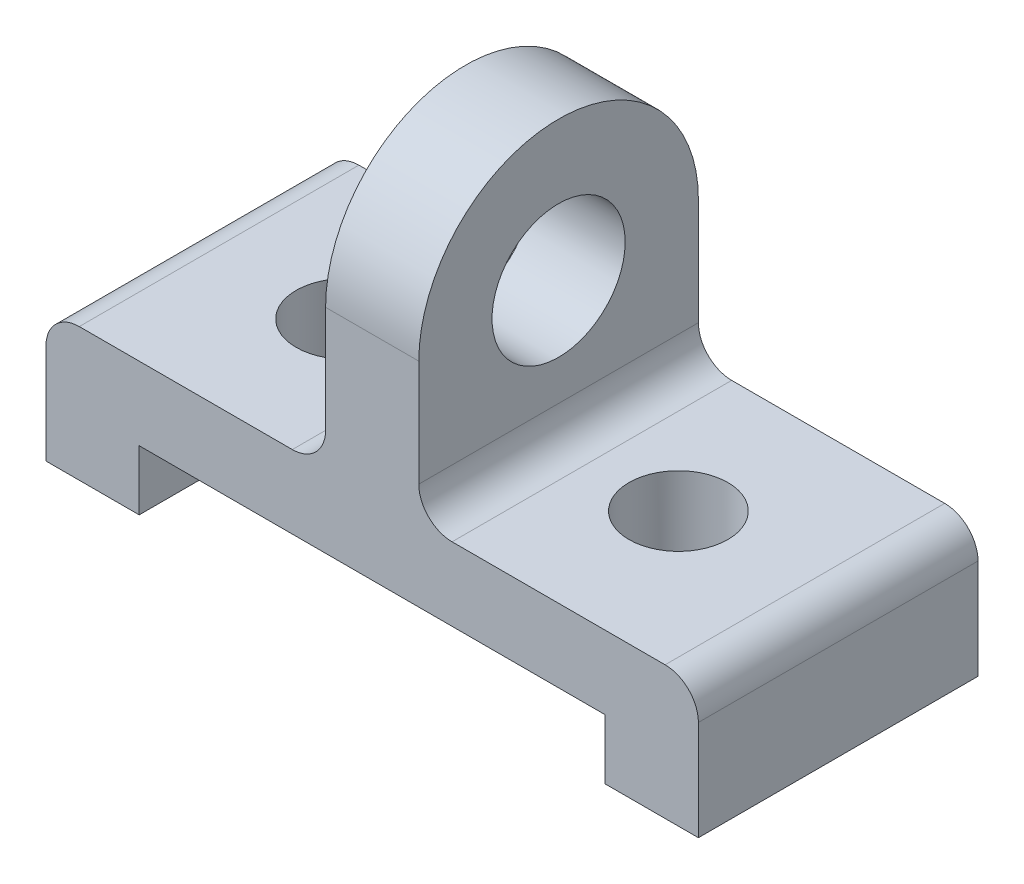
ISO-10303-21;
HEADER;
FILE_DESCRIPTION(('STEP AP214'),'2;1');
FILE_NAME('part.step','',(''),(''),'','','');
FILE_SCHEMA(('AUTOMOTIVE_DESIGN { 1 0 10303 214 1 1 1 1 }'));
ENDSEC;
DATA;
#1=APPLICATION_CONTEXT('core data for automotive mechanical design processes');
#2=APPLICATION_PROTOCOL_DEFINITION('international standard','automotive_design',2000,#1);
#3=PRODUCT_CONTEXT('',#1,'mechanical');
#4=PRODUCT('Part','Part','',(#3));
#5=PRODUCT_RELATED_PRODUCT_CATEGORY('part','',(#4));
#6=PRODUCT_DEFINITION_FORMATION('','',#4);
#7=PRODUCT_DEFINITION_CONTEXT('part definition',#1,'design');
#8=PRODUCT_DEFINITION('design','',#6,#7);
#9=PRODUCT_DEFINITION_SHAPE('','',#8);
#10=(LENGTH_UNIT() NAMED_UNIT(*) SI_UNIT(.MILLI.,.METRE.));
#11=(NAMED_UNIT(*) PLANE_ANGLE_UNIT() SI_UNIT($,.RADIAN.));
#12=(NAMED_UNIT(*) SI_UNIT($,.STERADIAN.) SOLID_ANGLE_UNIT());
#13=UNCERTAINTY_MEASURE_WITH_UNIT(LENGTH_MEASURE(1.E-05),#10,'distance_accuracy_value','');
#14=(GEOMETRIC_REPRESENTATION_CONTEXT(3) GLOBAL_UNCERTAINTY_ASSIGNED_CONTEXT((#13)) GLOBAL_UNIT_ASSIGNED_CONTEXT((#10,
#11,#12)) REPRESENTATION_CONTEXT('',''));
#15=CARTESIAN_POINT('',(0.,0.,0.));
#16=DIRECTION('',(0.,0.,1.));
#17=DIRECTION('',(1.,0.,0.));
#18=AXIS2_PLACEMENT_3D('',#15,#16,#17);
#19=CARTESIAN_POINT('',(7.,41.,0.));
#20=DIRECTION('',(-1.,0.,0.));
#21=DIRECTION('',(0.,0.,1.));
#22=AXIS2_PLACEMENT_3D('',#19,#20,#21);
#23=CYLINDRICAL_SURFACE('',#22,21.);
#24=DIRECTION('',(-1.,0.,0.));
#25=VECTOR('',#24,1.);
#26=CARTESIAN_POINT('',(-49.,41.,21.));
#27=LINE('',#26,#25);
#28=CARTESIAN_POINT('',(7.,41.,21.));
#29=VERTEX_POINT('',#28);
#30=CARTESIAN_POINT('',(-7.,41.,21.));
#31=VERTEX_POINT('',#30);
#32=EDGE_CURVE('E202',#29,#31,#27,.T.);
#33=ORIENTED_EDGE('',*,*,#32,.F.);
#34=CARTESIAN_POINT('',(7.,41.,0.));
#35=DIRECTION('',(-1.,0.,0.));
#36=DIRECTION('',(0.,0.,1.));
#37=AXIS2_PLACEMENT_3D('',#34,#35,#36);
#38=CIRCLE('',#37,21.);
#39=CARTESIAN_POINT('',(7.,41.,-21.));
#40=VERTEX_POINT('',#39);
#41=EDGE_CURVE('E208',#40,#29,#38,.F.);
#42=ORIENTED_EDGE('',*,*,#41,.F.);
#43=DIRECTION('',(-1.,0.,0.));
#44=VECTOR('',#43,1.);
#45=CARTESIAN_POINT('',(-49.,41.,-21.));
#46=LINE('',#45,#44);
#47=CARTESIAN_POINT('',(-7.,41.,-21.));
#48=VERTEX_POINT('',#47);
#49=EDGE_CURVE('E205',#48,#40,#46,.F.);
#50=ORIENTED_EDGE('',*,*,#49,.F.);
#51=CARTESIAN_POINT('',(-7.,41.,0.));
#52=DIRECTION('',(-1.,0.,0.));
#53=DIRECTION('',(0.,0.,1.));
#54=AXIS2_PLACEMENT_3D('',#51,#52,#53);
#55=CIRCLE('',#54,21.);
#56=EDGE_CURVE('E210',#31,#48,#55,.T.);
#57=ORIENTED_EDGE('',*,*,#56,.F.);
#58=EDGE_LOOP('',(#33,#42,#50,#57));
#59=FACE_BOUND('',#58,.T.);
#60=ADVANCED_FACE('F41',(#59),#23,.T.);
#61=CARTESIAN_POINT('',(0.,20.,0.));
#62=DIRECTION('',(0.,-1.,0.));
#63=DIRECTION('',(0.,0.,-1.));
#64=AXIS2_PLACEMENT_3D('',#61,#62,#63);
#65=PLANE('',#64);
#66=CARTESIAN_POINT('',(25.,20.,0.));
#67=DIRECTION('',(0.,1.,0.));
#68=DIRECTION('',(0.,0.,-1.));
#69=AXIS2_PLACEMENT_3D('',#66,#67,#68);
#70=CIRCLE('',#69,7.42425022338263);
#71=CARTESIAN_POINT('',(25.,20.,-7.42425022338264));
#72=VERTEX_POINT('',#71);
#73=EDGE_CURVE('E300',#72,#72,#70,.T.);
#74=ORIENTED_EDGE('',*,*,#73,.F.);
#75=EDGE_LOOP('',(#74));
#76=FACE_BOUND('',#75,.T.);
#77=DIRECTION('',(1.,0.,0.));
#78=VECTOR('',#77,1.);
#79=CARTESIAN_POINT('',(-49.,20.,21.));
#80=LINE('',#79,#78);
#81=CARTESIAN_POINT('',(12.,20.,21.));
#82=VERTEX_POINT('',#81);
#83=CARTESIAN_POINT('',(44.,20.,21.));
#84=VERTEX_POINT('',#83);
#85=EDGE_CURVE('E276',#82,#84,#80,.T.);
#86=ORIENTED_EDGE('',*,*,#85,.T.);
#87=DIRECTION('',(0.,0.,-1.));
#88=VECTOR('',#87,1.);
#89=CARTESIAN_POINT('',(44.,20.,0.));
#90=LINE('',#89,#88);
#91=CARTESIAN_POINT('',(44.,20.,-21.));
#92=VERTEX_POINT('',#91);
#93=EDGE_CURVE('E242',#84,#92,#90,.T.);
#94=ORIENTED_EDGE('',*,*,#93,.T.);
#95=DIRECTION('',(-1.,0.,0.));
#96=VECTOR('',#95,1.);
#97=CARTESIAN_POINT('',(-49.,20.,-21.));
#98=LINE('',#97,#96);
#99=CARTESIAN_POINT('',(12.,20.,-21.));
#100=VERTEX_POINT('',#99);
#101=EDGE_CURVE('E278',#92,#100,#98,.T.);
#102=ORIENTED_EDGE('',*,*,#101,.T.);
#103=DIRECTION('',(0.,0.,-1.));
#104=VECTOR('',#103,1.);
#105=CARTESIAN_POINT('',(12.,20.,21.));
#106=LINE('',#105,#104);
#107=EDGE_CURVE('E240',#100,#82,#106,.F.);
#108=ORIENTED_EDGE('',*,*,#107,.T.);
#109=EDGE_LOOP('',(#86,#94,#102,#108));
#110=FACE_BOUND('',#109,.T.);
#111=ADVANCED_FACE('F312',(#76,#110),#65,.F.);
#112=CARTESIAN_POINT('',(0.,0.,0.));
#113=DIRECTION('',(0.,-1.,0.));
#114=DIRECTION('',(0.,0.,-1.));
#115=AXIS2_PLACEMENT_3D('',#112,#113,#114);
#116=PLANE('',#115);
#117=DIRECTION('',(0.,0.,1.));
#118=VECTOR('',#117,1.);
#119=CARTESIAN_POINT('',(-35.,0.,-21.));
#120=LINE('',#119,#118);
#121=CARTESIAN_POINT('',(-35.,0.,-21.));
#122=VERTEX_POINT('',#121);
#123=CARTESIAN_POINT('',(-35.,0.,21.));
#124=VERTEX_POINT('',#123);
#125=EDGE_CURVE('E152',#122,#124,#120,.T.);
#126=ORIENTED_EDGE('',*,*,#125,.T.);
#127=DIRECTION('',(1.,0.,0.));
#128=VECTOR('',#127,1.);
#129=CARTESIAN_POINT('',(-49.,0.,21.));
#130=LINE('',#129,#128);
#131=CARTESIAN_POINT('',(-49.,0.,21.));
#132=VERTEX_POINT('',#131);
#133=EDGE_CURVE('E190',#132,#124,#130,.T.);
#134=ORIENTED_EDGE('',*,*,#133,.F.);
#135=DIRECTION('',(0.,0.,1.));
#136=VECTOR('',#135,1.);
#137=CARTESIAN_POINT('',(-49.,0.,21.));
#138=LINE('',#137,#136);
#139=CARTESIAN_POINT('',(-49.,0.,-21.));
#140=VERTEX_POINT('',#139);
#141=EDGE_CURVE('E178',#140,#132,#138,.T.);
#142=ORIENTED_EDGE('',*,*,#141,.F.);
#143=DIRECTION('',(-1.,0.,0.));
#144=VECTOR('',#143,1.);
#145=CARTESIAN_POINT('',(-49.,0.,-21.));
#146=LINE('',#145,#144);
#147=EDGE_CURVE('E169',#122,#140,#146,.T.);
#148=ORIENTED_EDGE('',*,*,#147,.F.);
#149=EDGE_LOOP('',(#126,#134,#142,#148));
#150=FACE_BOUND('',#149,.T.);
#151=ADVANCED_FACE('F176',(#150),#116,.T.);
#152=CARTESIAN_POINT('',(49.,20.,21.));
#153=DIRECTION('',(-1.,0.,0.));
#154=DIRECTION('',(0.,0.,1.));
#155=AXIS2_PLACEMENT_3D('',#152,#153,#154);
#156=PLANE('',#155);
#157=DIRECTION('',(0.,-1.,0.));
#158=VECTOR('',#157,1.);
#159=CARTESIAN_POINT('',(49.,20.,-21.));
#160=LINE('',#159,#158);
#161=CARTESIAN_POINT('',(49.,15.,-21.));
#162=VERTEX_POINT('',#161);
#163=CARTESIAN_POINT('',(49.,0.,-21.));
#164=VERTEX_POINT('',#163);
#165=EDGE_CURVE('E200',#162,#164,#160,.T.);
#166=ORIENTED_EDGE('',*,*,#165,.F.);
#167=DIRECTION('',(0.,0.,-1.));
#168=VECTOR('',#167,1.);
#169=CARTESIAN_POINT('',(49.,15.,21.));
#170=LINE('',#169,#168);
#171=CARTESIAN_POINT('',(49.,15.,21.));
#172=VERTEX_POINT('',#171);
#173=EDGE_CURVE('E245',#162,#172,#170,.F.);
#174=ORIENTED_EDGE('',*,*,#173,.T.);
#175=DIRECTION('',(0.,-1.,0.));
#176=VECTOR('',#175,1.);
#177=CARTESIAN_POINT('',(49.,20.,21.));
#178=LINE('',#177,#176);
#179=CARTESIAN_POINT('',(49.,0.,21.));
#180=VERTEX_POINT('',#179);
#181=EDGE_CURVE('E193',#172,#180,#178,.T.);
#182=ORIENTED_EDGE('',*,*,#181,.T.);
#183=DIRECTION('',(0.,0.,-1.));
#184=VECTOR('',#183,1.);
#185=CARTESIAN_POINT('',(49.,0.,21.));
#186=LINE('',#185,#184);
#187=EDGE_CURVE('E180',#180,#164,#186,.T.);
#188=ORIENTED_EDGE('',*,*,#187,.T.);
#189=EDGE_LOOP('',(#166,#174,#182,#188));
#190=FACE_BOUND('',#189,.T.);
#191=ADVANCED_FACE('F338',(#190),#156,.F.);
#192=CARTESIAN_POINT('',(-49.,20.,-21.));
#193=DIRECTION('',(0.,0.,1.));
#194=DIRECTION('',(1.,0.,0.));
#195=AXIS2_PLACEMENT_3D('',#192,#193,#194);
#196=PLANE('',#195);
#197=DIRECTION('',(0.,-1.,0.));
#198=VECTOR('',#197,1.);
#199=CARTESIAN_POINT('',(-49.,20.,-21.));
#200=LINE('',#199,#198);
#201=CARTESIAN_POINT('',(-49.,15.,-21.));
#202=VERTEX_POINT('',#201);
#203=EDGE_CURVE('E198',#202,#140,#200,.T.);
#204=ORIENTED_EDGE('',*,*,#203,.F.);
#205=CARTESIAN_POINT('',(-44.,15.,-21.));
#206=DIRECTION('',(0.,0.,1.));
#207=DIRECTION('',(1.,0.,0.));
#208=AXIS2_PLACEMENT_3D('',#205,#206,#207);
#209=CIRCLE('',#208,5.);
#210=CARTESIAN_POINT('',(-44.,20.,-21.));
#211=VERTEX_POINT('',#210);
#212=EDGE_CURVE('E238',#202,#211,#209,.F.);
#213=ORIENTED_EDGE('',*,*,#212,.T.);
#214=CARTESIAN_POINT('',(-12.,20.,-21.));
#215=VERTEX_POINT('',#214);
#216=EDGE_CURVE('E192',#215,#211,#98,.T.);
#217=ORIENTED_EDGE('',*,*,#216,.F.);
#218=CARTESIAN_POINT('',(-12.,25.,-21.));
#219=DIRECTION('',(0.,0.,1.));
#220=DIRECTION('',(1.,0.,0.));
#221=AXIS2_PLACEMENT_3D('',#218,#219,#220);
#222=CIRCLE('',#221,5.);
#223=CARTESIAN_POINT('',(-7.,25.,-21.));
#224=VERTEX_POINT('',#223);
#225=EDGE_CURVE('E49',#215,#224,#222,.T.);
#226=ORIENTED_EDGE('',*,*,#225,.T.);
#227=DIRECTION('',(0.,1.,0.));
#228=VECTOR('',#227,1.);
#229=CARTESIAN_POINT('',(-7.,20.,-21.));
#230=LINE('',#229,#228);
#231=EDGE_CURVE('E256',#224,#48,#230,.T.);
#232=ORIENTED_EDGE('',*,*,#231,.T.);
#233=ORIENTED_EDGE('',*,*,#49,.T.);
#234=DIRECTION('',(0.,1.,0.));
#235=VECTOR('',#234,1.);
#236=CARTESIAN_POINT('',(7.,20.,-21.));
#237=LINE('',#236,#235);
#238=CARTESIAN_POINT('',(7.,25.,-21.));
#239=VERTEX_POINT('',#238);
#240=EDGE_CURVE('E291',#239,#40,#237,.T.);
#241=ORIENTED_EDGE('',*,*,#240,.F.);
#242=CARTESIAN_POINT('',(12.,25.,-21.));
#243=DIRECTION('',(0.,0.,1.));
#244=DIRECTION('',(1.,0.,0.));
#245=AXIS2_PLACEMENT_3D('',#242,#243,#244);
#246=CIRCLE('',#245,5.);
#247=EDGE_CURVE('E62',#239,#100,#246,.T.);
#248=ORIENTED_EDGE('',*,*,#247,.T.);
#249=ORIENTED_EDGE('',*,*,#101,.F.);
#250=CARTESIAN_POINT('',(44.,15.,-21.));
#251=DIRECTION('',(0.,0.,1.));
#252=DIRECTION('',(1.,0.,0.));
#253=AXIS2_PLACEMENT_3D('',#250,#251,#252);
#254=CIRCLE('',#253,5.);
#255=EDGE_CURVE('E56',#92,#162,#254,.F.);
#256=ORIENTED_EDGE('',*,*,#255,.T.);
#257=ORIENTED_EDGE('',*,*,#165,.T.);
#258=CARTESIAN_POINT('',(35.,0.,-21.));
#259=VERTEX_POINT('',#258);
#260=EDGE_CURVE('E179',#164,#259,#146,.T.);
#261=ORIENTED_EDGE('',*,*,#260,.T.);
#262=DIRECTION('',(0.,1.,0.));
#263=VECTOR('',#262,1.);
#264=CARTESIAN_POINT('',(35.,0.,-21.));
#265=LINE('',#264,#263);
#266=CARTESIAN_POINT('',(35.,9.,-21.));
#267=VERTEX_POINT('',#266);
#268=EDGE_CURVE('E173',#259,#267,#265,.T.);
#269=ORIENTED_EDGE('',*,*,#268,.T.);
#270=DIRECTION('',(-1.,0.,0.));
#271=VECTOR('',#270,1.);
#272=CARTESIAN_POINT('',(-35.,9.,-21.));
#273=LINE('',#272,#271);
#274=CARTESIAN_POINT('',(-35.,9.,-21.));
#275=VERTEX_POINT('',#274);
#276=EDGE_CURVE('E164',#267,#275,#273,.T.);
#277=ORIENTED_EDGE('',*,*,#276,.T.);
#278=DIRECTION('',(0.,-1.,0.));
#279=VECTOR('',#278,1.);
#280=CARTESIAN_POINT('',(-35.,0.,-21.));
#281=LINE('',#280,#279);
#282=EDGE_CURVE('E155',#275,#122,#281,.T.);
#283=ORIENTED_EDGE('',*,*,#282,.T.);
#284=ORIENTED_EDGE('',*,*,#147,.T.);
#285=EDGE_LOOP('',(#204,#213,#217,#226,#232,#233,#241,#248,#249,#256,#257,#261,#269,#277,#283,#284));
#286=FACE_BOUND('',#285,.T.);
#287=ADVANCED_FACE('F168',(#286),#196,.F.);
#288=CARTESIAN_POINT('',(-49.,20.,21.));
#289=DIRECTION('',(1.,0.,0.));
#290=DIRECTION('',(0.,0.,-1.));
#291=AXIS2_PLACEMENT_3D('',#288,#289,#290);
#292=PLANE('',#291);
#293=DIRECTION('',(0.,-1.,0.));
#294=VECTOR('',#293,1.);
#295=CARTESIAN_POINT('',(-49.,20.,21.));
#296=LINE('',#295,#294);
#297=CARTESIAN_POINT('',(-49.,15.,21.));
#298=VERTEX_POINT('',#297);
#299=EDGE_CURVE('E195',#298,#132,#296,.T.);
#300=ORIENTED_EDGE('',*,*,#299,.F.);
#301=DIRECTION('',(0.,0.,1.));
#302=VECTOR('',#301,1.);
#303=CARTESIAN_POINT('',(-49.,15.,21.));
#304=LINE('',#303,#302);
#305=EDGE_CURVE('E235',#298,#202,#304,.F.);
#306=ORIENTED_EDGE('',*,*,#305,.T.);
#307=ORIENTED_EDGE('',*,*,#203,.T.);
#308=ORIENTED_EDGE('',*,*,#141,.T.);
#309=EDGE_LOOP('',(#300,#306,#307,#308));
#310=FACE_BOUND('',#309,.T.);
#311=ADVANCED_FACE('F320',(#310),#292,.F.);
#312=CARTESIAN_POINT('',(-49.,20.,21.));
#313=DIRECTION('',(0.,0.,-1.));
#314=DIRECTION('',(-1.,0.,0.));
#315=AXIS2_PLACEMENT_3D('',#312,#313,#314);
#316=PLANE('',#315);
#317=CARTESIAN_POINT('',(-44.,20.,21.));
#318=VERTEX_POINT('',#317);
#319=CARTESIAN_POINT('',(-12.,20.,21.));
#320=VERTEX_POINT('',#319);
#321=EDGE_CURVE('E196',#318,#320,#80,.T.);
#322=ORIENTED_EDGE('',*,*,#321,.F.);
#323=CARTESIAN_POINT('',(-44.,15.,21.));
#324=DIRECTION('',(0.,0.,-1.));
#325=DIRECTION('',(-1.,0.,0.));
#326=AXIS2_PLACEMENT_3D('',#323,#324,#325);
#327=CIRCLE('',#326,5.);
#328=EDGE_CURVE('E233',#318,#298,#327,.F.);
#329=ORIENTED_EDGE('',*,*,#328,.T.);
#330=ORIENTED_EDGE('',*,*,#299,.T.);
#331=ORIENTED_EDGE('',*,*,#133,.T.);
#332=DIRECTION('',(0.,-1.,0.));
#333=VECTOR('',#332,1.);
#334=CARTESIAN_POINT('',(-35.,0.,21.));
#335=LINE('',#334,#333);
#336=CARTESIAN_POINT('',(-35.,9.,21.));
#337=VERTEX_POINT('',#336);
#338=EDGE_CURVE('E158',#337,#124,#335,.T.);
#339=ORIENTED_EDGE('',*,*,#338,.F.);
#340=DIRECTION('',(-1.,0.,0.));
#341=VECTOR('',#340,1.);
#342=CARTESIAN_POINT('',(-35.,9.,21.));
#343=LINE('',#342,#341);
#344=CARTESIAN_POINT('',(35.,9.,21.));
#345=VERTEX_POINT('',#344);
#346=EDGE_CURVE('E174',#345,#337,#343,.T.);
#347=ORIENTED_EDGE('',*,*,#346,.F.);
#348=DIRECTION('',(0.,1.,0.));
#349=VECTOR('',#348,1.);
#350=CARTESIAN_POINT('',(35.,0.,21.));
#351=LINE('',#350,#349);
#352=CARTESIAN_POINT('',(35.,0.,21.));
#353=VERTEX_POINT('',#352);
#354=EDGE_CURVE('E287',#353,#345,#351,.T.);
#355=ORIENTED_EDGE('',*,*,#354,.F.);
#356=EDGE_CURVE('E189',#353,#180,#130,.T.);
#357=ORIENTED_EDGE('',*,*,#356,.T.);
#358=ORIENTED_EDGE('',*,*,#181,.F.);
#359=CARTESIAN_POINT('',(44.,15.,21.));
#360=DIRECTION('',(0.,0.,-1.));
#361=DIRECTION('',(-1.,0.,0.));
#362=AXIS2_PLACEMENT_3D('',#359,#360,#361);
#363=CIRCLE('',#362,5.);
#364=EDGE_CURVE('E231',#172,#84,#363,.F.);
#365=ORIENTED_EDGE('',*,*,#364,.T.);
#366=ORIENTED_EDGE('',*,*,#85,.F.);
#367=CARTESIAN_POINT('',(12.,25.,21.));
#368=DIRECTION('',(0.,0.,-1.));
#369=DIRECTION('',(-1.,0.,0.));
#370=AXIS2_PLACEMENT_3D('',#367,#368,#369);
#371=CIRCLE('',#370,5.);
#372=CARTESIAN_POINT('',(7.,25.,21.));
#373=VERTEX_POINT('',#372);
#374=EDGE_CURVE('E253',#82,#373,#371,.T.);
#375=ORIENTED_EDGE('',*,*,#374,.T.);
#376=DIRECTION('',(0.,-1.,0.));
#377=VECTOR('',#376,1.);
#378=CARTESIAN_POINT('',(7.,20.,21.));
#379=LINE('',#378,#377);
#380=EDGE_CURVE('E266',#29,#373,#379,.T.);
#381=ORIENTED_EDGE('',*,*,#380,.F.);
#382=ORIENTED_EDGE('',*,*,#32,.T.);
#383=DIRECTION('',(0.,-1.,0.));
#384=VECTOR('',#383,1.);
#385=CARTESIAN_POINT('',(-7.,20.,21.));
#386=LINE('',#385,#384);
#387=CARTESIAN_POINT('',(-7.,25.,21.));
#388=VERTEX_POINT('',#387);
#389=EDGE_CURVE('E217',#31,#388,#386,.T.);
#390=ORIENTED_EDGE('',*,*,#389,.T.);
#391=CARTESIAN_POINT('',(-12.,25.,21.));
#392=DIRECTION('',(0.,0.,-1.));
#393=DIRECTION('',(-1.,0.,0.));
#394=AXIS2_PLACEMENT_3D('',#391,#392,#393);
#395=CIRCLE('',#394,5.);
#396=EDGE_CURVE('E11',#388,#320,#395,.T.);
#397=ORIENTED_EDGE('',*,*,#396,.T.);
#398=EDGE_LOOP('',(#322,#329,#330,#331,#339,#347,#355,#357,#358,#365,#366,#375,#381,#382,#390,#397));
#399=FACE_BOUND('',#398,.T.);
#400=ADVANCED_FACE('F272',(#399),#316,.F.);
#401=CARTESIAN_POINT('',(-25.,20.,0.));
#402=DIRECTION('',(0.,1.,0.));
#403=DIRECTION('',(0.,0.,1.));
#404=AXIS2_PLACEMENT_3D('',#401,#402,#403);
#405=CIRCLE('',#404,7.42425022338264);
#406=CARTESIAN_POINT('',(-25.,20.,7.42425022338264));
#407=VERTEX_POINT('',#406);
#408=EDGE_CURVE('E223',#407,#407,#405,.T.);
#409=ORIENTED_EDGE('',*,*,#408,.F.);
#410=EDGE_LOOP('',(#409));
#411=FACE_BOUND('',#410,.T.);
#412=ORIENTED_EDGE('',*,*,#216,.T.);
#413=DIRECTION('',(0.,0.,1.));
#414=VECTOR('',#413,1.);
#415=CARTESIAN_POINT('',(-44.,20.,0.));
#416=LINE('',#415,#414);
#417=EDGE_CURVE('E228',#211,#318,#416,.T.);
#418=ORIENTED_EDGE('',*,*,#417,.T.);
#419=ORIENTED_EDGE('',*,*,#321,.T.);
#420=DIRECTION('',(0.,0.,-1.));
#421=VECTOR('',#420,1.);
#422=CARTESIAN_POINT('',(-12.,20.,0.));
#423=LINE('',#422,#421);
#424=EDGE_CURVE('E213',#320,#215,#423,.T.);
#425=ORIENTED_EDGE('',*,*,#424,.T.);
#426=EDGE_LOOP('',(#412,#418,#419,#425));
#427=FACE_BOUND('',#426,.T.);
#428=ADVANCED_FACE('F274',(#411,#427),#65,.F.);
#429=DIRECTION('',(0.,0.,1.));
#430=VECTOR('',#429,1.);
#431=CARTESIAN_POINT('',(35.,0.,-21.));
#432=LINE('',#431,#430);
#433=EDGE_CURVE('E163',#259,#353,#432,.T.);
#434=ORIENTED_EDGE('',*,*,#433,.F.);
#435=ORIENTED_EDGE('',*,*,#260,.F.);
#436=ORIENTED_EDGE('',*,*,#187,.F.);
#437=ORIENTED_EDGE('',*,*,#356,.F.);
#438=EDGE_LOOP('',(#434,#435,#436,#437));
#439=FACE_BOUND('',#438,.T.);
#440=ADVANCED_FACE('F310',(#439),#116,.T.);
#441=CARTESIAN_POINT('',(-35.,0.,-21.));
#442=DIRECTION('',(-1.,0.,0.));
#443=DIRECTION('',(0.,0.,1.));
#444=AXIS2_PLACEMENT_3D('',#441,#442,#443);
#445=PLANE('',#444);
#446=ORIENTED_EDGE('',*,*,#338,.T.);
#447=ORIENTED_EDGE('',*,*,#125,.F.);
#448=ORIENTED_EDGE('',*,*,#282,.F.);
#449=DIRECTION('',(0.,0.,1.));
#450=VECTOR('',#449,1.);
#451=CARTESIAN_POINT('',(-35.,9.,-21.));
#452=LINE('',#451,#450);
#453=EDGE_CURVE('E184',#275,#337,#452,.T.);
#454=ORIENTED_EDGE('',*,*,#453,.T.);
#455=EDGE_LOOP('',(#446,#447,#448,#454));
#456=FACE_BOUND('',#455,.T.);
#457=ADVANCED_FACE('F154',(#456),#445,.F.);
#458=CARTESIAN_POINT('',(-35.,9.,-21.));
#459=DIRECTION('',(0.,1.,0.));
#460=DIRECTION('',(0.,0.,1.));
#461=AXIS2_PLACEMENT_3D('',#458,#459,#460);
#462=PLANE('',#461);
#463=CARTESIAN_POINT('',(-25.,9.,0.));
#464=DIRECTION('',(0.,1.,0.));
#465=DIRECTION('',(0.,0.,1.));
#466=AXIS2_PLACEMENT_3D('',#463,#464,#465);
#467=CIRCLE('',#466,7.42425022338264);
#468=CARTESIAN_POINT('',(-25.,9.,7.42425022338264));
#469=VERTEX_POINT('',#468);
#470=EDGE_CURVE('E222',#469,#469,#467,.T.);
#471=ORIENTED_EDGE('',*,*,#470,.T.);
#472=EDGE_LOOP('',(#471));
#473=FACE_BOUND('',#472,.T.);
#474=CARTESIAN_POINT('',(25.,9.,0.));
#475=DIRECTION('',(0.,1.,0.));
#476=DIRECTION('',(0.,0.,1.));
#477=AXIS2_PLACEMENT_3D('',#474,#475,#476);
#478=CIRCLE('',#477,7.42425022338263);
#479=CARTESIAN_POINT('',(25.,9.,7.42425022338263));
#480=VERTEX_POINT('',#479);
#481=EDGE_CURVE('E219',#480,#480,#478,.T.);
#482=ORIENTED_EDGE('',*,*,#481,.T.);
#483=EDGE_LOOP('',(#482));
#484=FACE_BOUND('',#483,.T.);
#485=ORIENTED_EDGE('',*,*,#346,.T.);
#486=ORIENTED_EDGE('',*,*,#453,.F.);
#487=ORIENTED_EDGE('',*,*,#276,.F.);
#488=DIRECTION('',(0.,0.,1.));
#489=VECTOR('',#488,1.);
#490=CARTESIAN_POINT('',(35.,9.,-21.));
#491=LINE('',#490,#489);
#492=EDGE_CURVE('E282',#267,#345,#491,.T.);
#493=ORIENTED_EDGE('',*,*,#492,.T.);
#494=EDGE_LOOP('',(#485,#486,#487,#493));
#495=FACE_BOUND('',#494,.T.);
#496=ADVANCED_FACE('F370',(#473,#484,#495),#462,.F.);
#497=CARTESIAN_POINT('',(35.,0.,-21.));
#498=DIRECTION('',(1.,0.,0.));
#499=DIRECTION('',(0.,0.,-1.));
#500=AXIS2_PLACEMENT_3D('',#497,#498,#499);
#501=PLANE('',#500);
#502=ORIENTED_EDGE('',*,*,#354,.T.);
#503=ORIENTED_EDGE('',*,*,#492,.F.);
#504=ORIENTED_EDGE('',*,*,#268,.F.);
#505=ORIENTED_EDGE('',*,*,#433,.T.);
#506=EDGE_LOOP('',(#502,#503,#504,#505));
#507=FACE_BOUND('',#506,.T.);
#508=ADVANCED_FACE('F361',(#507),#501,.F.);
#509=CARTESIAN_POINT('',(7.,0.,0.));
#510=DIRECTION('',(-1.,0.,0.));
#511=DIRECTION('',(0.,0.,1.));
#512=AXIS2_PLACEMENT_3D('',#509,#510,#511);
#513=PLANE('',#512);
#514=CARTESIAN_POINT('',(7.,41.,0.));
#515=DIRECTION('',(1.,0.,0.));
#516=DIRECTION('',(0.,0.,-1.));
#517=AXIS2_PLACEMENT_3D('',#514,#515,#516);
#518=CIRCLE('',#517,10.);
#519=CARTESIAN_POINT('',(7.,41.,-10.));
#520=VERTEX_POINT('',#519);
#521=EDGE_CURVE('E218',#520,#520,#518,.T.);
#522=ORIENTED_EDGE('',*,*,#521,.F.);
#523=EDGE_LOOP('',(#522));
#524=FACE_BOUND('',#523,.T.);
#525=ORIENTED_EDGE('',*,*,#380,.T.);
#526=DIRECTION('',(0.,0.,-1.));
#527=VECTOR('',#526,1.);
#528=CARTESIAN_POINT('',(7.,25.,-21.));
#529=LINE('',#528,#527);
#530=EDGE_CURVE('E247',#373,#239,#529,.T.);
#531=ORIENTED_EDGE('',*,*,#530,.T.);
#532=ORIENTED_EDGE('',*,*,#240,.T.);
#533=ORIENTED_EDGE('',*,*,#41,.T.);
#534=EDGE_LOOP('',(#525,#531,#532,#533));
#535=FACE_BOUND('',#534,.T.);
#536=ADVANCED_FACE('F359',(#524,#535),#513,.F.);
#537=CARTESIAN_POINT('',(-7.,0.,0.));
#538=DIRECTION('',(-1.,0.,0.));
#539=DIRECTION('',(0.,0.,1.));
#540=AXIS2_PLACEMENT_3D('',#537,#538,#539);
#541=PLANE('',#540);
#542=CARTESIAN_POINT('',(-7.,41.,0.));
#543=DIRECTION('',(-1.,0.,0.));
#544=DIRECTION('',(0.,0.,1.));
#545=AXIS2_PLACEMENT_3D('',#542,#543,#544);
#546=CIRCLE('',#545,10.);
#547=CARTESIAN_POINT('',(-7.,41.,10.));
#548=VERTEX_POINT('',#547);
#549=EDGE_CURVE('E214',#548,#548,#546,.T.);
#550=ORIENTED_EDGE('',*,*,#549,.F.);
#551=EDGE_LOOP('',(#550));
#552=FACE_BOUND('',#551,.T.);
#553=ORIENTED_EDGE('',*,*,#231,.F.);
#554=DIRECTION('',(0.,0.,-1.));
#555=VECTOR('',#554,1.);
#556=CARTESIAN_POINT('',(-7.,25.,0.));
#557=LINE('',#556,#555);
#558=EDGE_CURVE('E250',#224,#388,#557,.F.);
#559=ORIENTED_EDGE('',*,*,#558,.T.);
#560=ORIENTED_EDGE('',*,*,#389,.F.);
#561=ORIENTED_EDGE('',*,*,#56,.T.);
#562=EDGE_LOOP('',(#553,#559,#560,#561));
#563=FACE_BOUND('',#562,.T.);
#564=ADVANCED_FACE('F262',(#552,#563),#541,.T.);
#565=CARTESIAN_POINT('',(-49.,41.,0.));
#566=DIRECTION('',(1.,0.,0.));
#567=DIRECTION('',(0.,0.,-1.));
#568=AXIS2_PLACEMENT_3D('',#565,#566,#567);
#569=CYLINDRICAL_SURFACE('',#568,10.);
#570=ORIENTED_EDGE('',*,*,#549,.T.);
#571=EDGE_LOOP('',(#570));
#572=FACE_BOUND('',#571,.T.);
#573=ORIENTED_EDGE('',*,*,#521,.T.);
#574=EDGE_LOOP('',(#573));
#575=FACE_BOUND('',#574,.T.);
#576=ADVANCED_FACE('F367',(#572,#575),#569,.F.);
#577=CARTESIAN_POINT('',(25.,0.,0.));
#578=DIRECTION('',(0.,1.,0.));
#579=DIRECTION('',(0.,0.,1.));
#580=AXIS2_PLACEMENT_3D('',#577,#578,#579);
#581=CYLINDRICAL_SURFACE('',#580,7.42425022338263);
#582=ORIENTED_EDGE('',*,*,#73,.T.);
#583=EDGE_LOOP('',(#582));
#584=FACE_BOUND('',#583,.T.);
#585=ORIENTED_EDGE('',*,*,#481,.F.);
#586=EDGE_LOOP('',(#585));
#587=FACE_BOUND('',#586,.T.);
#588=ADVANCED_FACE('F442',(#584,#587),#581,.F.);
#589=CARTESIAN_POINT('',(-25.,0.,0.));
#590=DIRECTION('',(0.,1.,0.));
#591=DIRECTION('',(0.,0.,1.));
#592=AXIS2_PLACEMENT_3D('',#589,#590,#591);
#593=CYLINDRICAL_SURFACE('',#592,7.42425022338264);
#594=ORIENTED_EDGE('',*,*,#408,.T.);
#595=EDGE_LOOP('',(#594));
#596=FACE_BOUND('',#595,.T.);
#597=ORIENTED_EDGE('',*,*,#470,.F.);
#598=EDGE_LOOP('',(#597));
#599=FACE_BOUND('',#598,.T.);
#600=ADVANCED_FACE('F306',(#596,#599),#593,.F.);
#601=CARTESIAN_POINT('',(-44.,15.,0.));
#602=DIRECTION('',(0.,0.,1.));
#603=DIRECTION('',(1.,0.,0.));
#604=AXIS2_PLACEMENT_3D('',#601,#602,#603);
#605=CYLINDRICAL_SURFACE('',#604,5.);
#606=ORIENTED_EDGE('',*,*,#212,.F.);
#607=ORIENTED_EDGE('',*,*,#305,.F.);
#608=ORIENTED_EDGE('',*,*,#328,.F.);
#609=ORIENTED_EDGE('',*,*,#417,.F.);
#610=EDGE_LOOP('',(#606,#607,#608,#609));
#611=FACE_BOUND('',#610,.T.);
#612=ADVANCED_FACE('F340',(#611),#605,.T.);
#613=CARTESIAN_POINT('',(44.,15.,0.));
#614=DIRECTION('',(0.,0.,-1.));
#615=DIRECTION('',(-1.,0.,0.));
#616=AXIS2_PLACEMENT_3D('',#613,#614,#615);
#617=CYLINDRICAL_SURFACE('',#616,5.);
#618=ORIENTED_EDGE('',*,*,#364,.F.);
#619=ORIENTED_EDGE('',*,*,#173,.F.);
#620=ORIENTED_EDGE('',*,*,#255,.F.);
#621=ORIENTED_EDGE('',*,*,#93,.F.);
#622=EDGE_LOOP('',(#618,#619,#620,#621));
#623=FACE_BOUND('',#622,.T.);
#624=ADVANCED_FACE('F343',(#623),#617,.T.);
#625=CARTESIAN_POINT('',(12.,25.,0.));
#626=DIRECTION('',(0.,0.,1.));
#627=DIRECTION('',(1.,0.,0.));
#628=AXIS2_PLACEMENT_3D('',#625,#626,#627);
#629=CYLINDRICAL_SURFACE('',#628,5.);
#630=ORIENTED_EDGE('',*,*,#374,.F.);
#631=ORIENTED_EDGE('',*,*,#107,.F.);
#632=ORIENTED_EDGE('',*,*,#247,.F.);
#633=ORIENTED_EDGE('',*,*,#530,.F.);
#634=EDGE_LOOP('',(#630,#631,#632,#633));
#635=FACE_BOUND('',#634,.T.);
#636=ADVANCED_FACE('F346',(#635),#629,.F.);
#637=CARTESIAN_POINT('',(-12.,25.,0.));
#638=DIRECTION('',(0.,0.,-1.));
#639=DIRECTION('',(-1.,0.,0.));
#640=AXIS2_PLACEMENT_3D('',#637,#638,#639);
#641=CYLINDRICAL_SURFACE('',#640,5.);
#642=ORIENTED_EDGE('',*,*,#396,.F.);
#643=ORIENTED_EDGE('',*,*,#558,.F.);
#644=ORIENTED_EDGE('',*,*,#225,.F.);
#645=ORIENTED_EDGE('',*,*,#424,.F.);
#646=EDGE_LOOP('',(#642,#643,#644,#645));
#647=FACE_BOUND('',#646,.T.);
#648=ADVANCED_FACE('F43',(#647),#641,.F.);
#649=CLOSED_SHELL('',(#60,#111,#151,#191,#287,#311,#400,#428,#440,#457,#496,#508,#536,#564,#576,
#588,#600,#612,#624,#636,#648));
#650=MANIFOLD_SOLID_BREP('B2',#649);
#651=ADVANCED_BREP_SHAPE_REPRESENTATION('',(#18,#650),#14);
#652=SHAPE_DEFINITION_REPRESENTATION(#9,#651);
ENDSEC;
END-ISO-10303-21;
